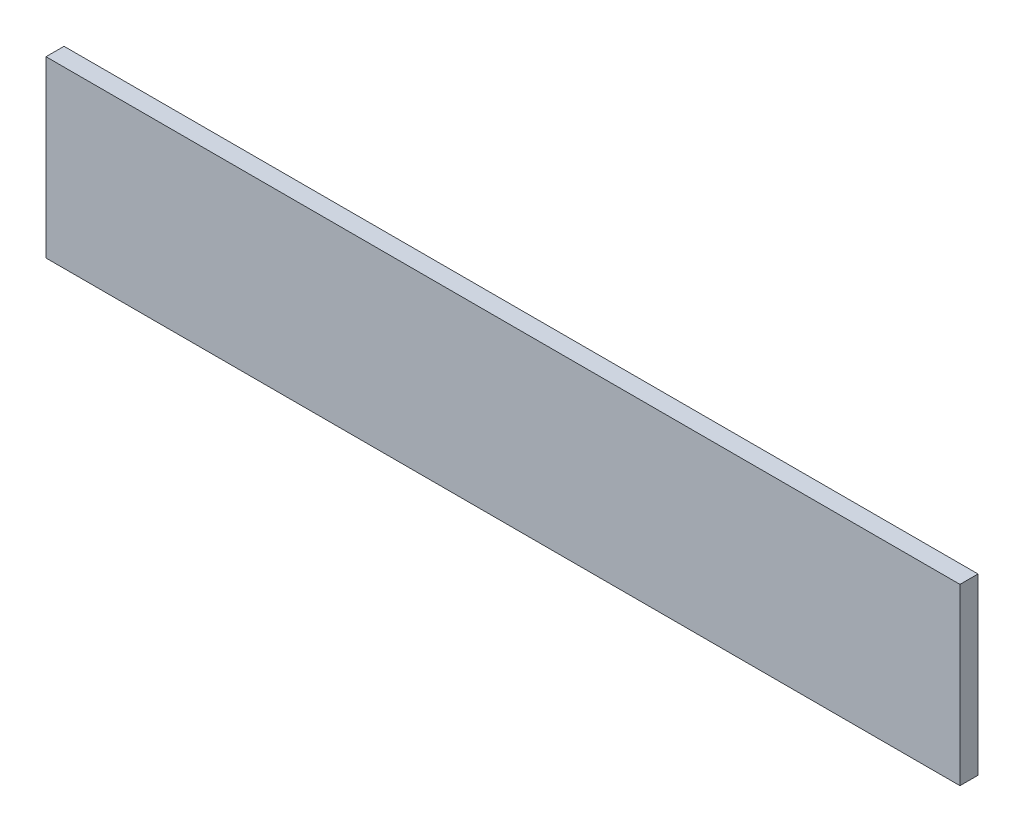
ISO-10303-21;
HEADER;
FILE_DESCRIPTION(('STEP AP214'),'2;1');
FILE_NAME('part.step','',(''),(''),'','','');
FILE_SCHEMA(('AUTOMOTIVE_DESIGN { 1 0 10303 214 1 1 1 1 }'));
ENDSEC;
DATA;
#1=APPLICATION_CONTEXT('core data for automotive mechanical design processes');
#2=APPLICATION_PROTOCOL_DEFINITION('international standard','automotive_design',2000,#1);
#3=PRODUCT_CONTEXT('',#1,'mechanical');
#4=PRODUCT('Part','Part','',(#3));
#5=PRODUCT_RELATED_PRODUCT_CATEGORY('part','',(#4));
#6=PRODUCT_DEFINITION_FORMATION('','',#4);
#7=PRODUCT_DEFINITION_CONTEXT('part definition',#1,'design');
#8=PRODUCT_DEFINITION('design','',#6,#7);
#9=PRODUCT_DEFINITION_SHAPE('','',#8);
#10=(LENGTH_UNIT() NAMED_UNIT(*) SI_UNIT(.MILLI.,.METRE.));
#11=(NAMED_UNIT(*) PLANE_ANGLE_UNIT() SI_UNIT($,.RADIAN.));
#12=(NAMED_UNIT(*) SI_UNIT($,.STERADIAN.) SOLID_ANGLE_UNIT());
#13=UNCERTAINTY_MEASURE_WITH_UNIT(LENGTH_MEASURE(1.E-05),#10,'distance_accuracy_value','');
#14=(GEOMETRIC_REPRESENTATION_CONTEXT(3) GLOBAL_UNCERTAINTY_ASSIGNED_CONTEXT((#13)) GLOBAL_UNIT_ASSIGNED_CONTEXT((#10,
#11,#12)) REPRESENTATION_CONTEXT('',''));
#15=CARTESIAN_POINT('',(0.,0.,0.));
#16=DIRECTION('',(0.,0.,1.));
#17=DIRECTION('',(1.,0.,0.));
#18=AXIS2_PLACEMENT_3D('',#15,#16,#17);
#19=CARTESIAN_POINT('',(0.,0.,19.05));
#20=DIRECTION('',(1.,0.,0.));
#21=DIRECTION('',(0.,0.,-1.));
#22=AXIS2_PLACEMENT_3D('',#19,#20,#21);
#23=PLANE('',#22);
#24=DIRECTION('',(0.,-1.,0.));
#25=VECTOR('',#24,1.);
#26=CARTESIAN_POINT('',(0.,0.,0.));
#27=LINE('',#26,#25);
#28=CARTESIAN_POINT('',(0.,184.15,0.));
#29=VERTEX_POINT('',#28);
#30=CARTESIAN_POINT('',(0.,0.,0.));
#31=VERTEX_POINT('',#30);
#32=EDGE_CURVE('E96',#29,#31,#27,.T.);
#33=ORIENTED_EDGE('',*,*,#32,.T.);
#34=DIRECTION('',(0.,0.,-1.));
#35=VECTOR('',#34,1.);
#36=CARTESIAN_POINT('',(0.,0.,19.05));
#37=LINE('',#36,#35);
#38=CARTESIAN_POINT('',(0.,0.,19.05));
#39=VERTEX_POINT('',#38);
#40=EDGE_CURVE('E11',#39,#31,#37,.T.);
#41=ORIENTED_EDGE('',*,*,#40,.F.);
#42=DIRECTION('',(0.,-1.,0.));
#43=VECTOR('',#42,1.);
#44=CARTESIAN_POINT('',(0.,0.,19.05));
#45=LINE('',#44,#43);
#46=CARTESIAN_POINT('',(0.,184.15,19.05));
#47=VERTEX_POINT('',#46);
#48=EDGE_CURVE('E84',#47,#39,#45,.T.);
#49=ORIENTED_EDGE('',*,*,#48,.F.);
#50=DIRECTION('',(0.,0.,-1.));
#51=VECTOR('',#50,1.);
#52=CARTESIAN_POINT('',(0.,184.15,19.05));
#53=LINE('',#52,#51);
#54=EDGE_CURVE('E92',#47,#29,#53,.T.);
#55=ORIENTED_EDGE('',*,*,#54,.T.);
#56=EDGE_LOOP('',(#33,#41,#49,#55));
#57=FACE_BOUND('',#56,.T.);
#58=ADVANCED_FACE('F33',(#57),#23,.F.);
#59=CARTESIAN_POINT('',(0.,0.,19.05));
#60=DIRECTION('',(0.,1.,0.));
#61=DIRECTION('',(0.,0.,1.));
#62=AXIS2_PLACEMENT_3D('',#59,#60,#61);
#63=PLANE('',#62);
#64=DIRECTION('',(1.,0.,0.));
#65=VECTOR('',#64,1.);
#66=CARTESIAN_POINT('',(0.,0.,0.));
#67=LINE('',#66,#65);
#68=CARTESIAN_POINT('',(965.2,0.,0.));
#69=VERTEX_POINT('',#68);
#70=EDGE_CURVE('E88',#31,#69,#67,.T.);
#71=ORIENTED_EDGE('',*,*,#70,.T.);
#72=DIRECTION('',(0.,0.,-1.));
#73=VECTOR('',#72,1.);
#74=CARTESIAN_POINT('',(965.2,0.,19.05));
#75=LINE('',#74,#73);
#76=CARTESIAN_POINT('',(965.2,0.,19.05));
#77=VERTEX_POINT('',#76);
#78=EDGE_CURVE('E41',#77,#69,#75,.T.);
#79=ORIENTED_EDGE('',*,*,#78,.F.);
#80=DIRECTION('',(1.,0.,0.));
#81=VECTOR('',#80,1.);
#82=CARTESIAN_POINT('',(0.,0.,19.05));
#83=LINE('',#82,#81);
#84=EDGE_CURVE('E79',#39,#77,#83,.T.);
#85=ORIENTED_EDGE('',*,*,#84,.F.);
#86=ORIENTED_EDGE('',*,*,#40,.T.);
#87=EDGE_LOOP('',(#71,#79,#85,#86));
#88=FACE_BOUND('',#87,.T.);
#89=ADVANCED_FACE('F87',(#88),#63,.F.);
#90=CARTESIAN_POINT('',(965.2,0.,19.05));
#91=DIRECTION('',(-1.,0.,0.));
#92=DIRECTION('',(0.,0.,1.));
#93=AXIS2_PLACEMENT_3D('',#90,#91,#92);
#94=PLANE('',#93);
#95=DIRECTION('',(0.,1.,0.));
#96=VECTOR('',#95,1.);
#97=CARTESIAN_POINT('',(965.2,0.,0.));
#98=LINE('',#97,#96);
#99=CARTESIAN_POINT('',(965.2,184.15,0.));
#100=VERTEX_POINT('',#99);
#101=EDGE_CURVE('E66',#69,#100,#98,.T.);
#102=ORIENTED_EDGE('',*,*,#101,.T.);
#103=DIRECTION('',(0.,0.,-1.));
#104=VECTOR('',#103,1.);
#105=CARTESIAN_POINT('',(965.2,184.15,19.05));
#106=LINE('',#105,#104);
#107=CARTESIAN_POINT('',(965.2,184.15,19.05));
#108=VERTEX_POINT('',#107);
#109=EDGE_CURVE('E89',#108,#100,#106,.T.);
#110=ORIENTED_EDGE('',*,*,#109,.F.);
#111=DIRECTION('',(0.,1.,0.));
#112=VECTOR('',#111,1.);
#113=CARTESIAN_POINT('',(965.2,0.,19.05));
#114=LINE('',#113,#112);
#115=EDGE_CURVE('E82',#77,#108,#114,.T.);
#116=ORIENTED_EDGE('',*,*,#115,.F.);
#117=ORIENTED_EDGE('',*,*,#78,.T.);
#118=EDGE_LOOP('',(#102,#110,#116,#117));
#119=FACE_BOUND('',#118,.T.);
#120=ADVANCED_FACE('F90',(#119),#94,.F.);
#121=CARTESIAN_POINT('',(0.,184.15,19.05));
#122=DIRECTION('',(0.,-1.,0.));
#123=DIRECTION('',(0.,0.,-1.));
#124=AXIS2_PLACEMENT_3D('',#121,#122,#123);
#125=PLANE('',#124);
#126=DIRECTION('',(-1.,0.,0.));
#127=VECTOR('',#126,1.);
#128=CARTESIAN_POINT('',(0.,184.15,0.));
#129=LINE('',#128,#127);
#130=EDGE_CURVE('E72',#100,#29,#129,.T.);
#131=ORIENTED_EDGE('',*,*,#130,.T.);
#132=ORIENTED_EDGE('',*,*,#54,.F.);
#133=DIRECTION('',(-1.,0.,0.));
#134=VECTOR('',#133,1.);
#135=CARTESIAN_POINT('',(0.,184.15,19.05));
#136=LINE('',#135,#134);
#137=EDGE_CURVE('E49',#108,#47,#136,.T.);
#138=ORIENTED_EDGE('',*,*,#137,.F.);
#139=ORIENTED_EDGE('',*,*,#109,.T.);
#140=EDGE_LOOP('',(#131,#132,#138,#139));
#141=FACE_BOUND('',#140,.T.);
#142=ADVANCED_FACE('F103',(#141),#125,.F.);
#143=CARTESIAN_POINT('',(0.,0.,19.05));
#144=DIRECTION('',(0.,0.,-1.));
#145=DIRECTION('',(-1.,0.,0.));
#146=AXIS2_PLACEMENT_3D('',#143,#144,#145);
#147=PLANE('',#146);
#148=ORIENTED_EDGE('',*,*,#48,.T.);
#149=ORIENTED_EDGE('',*,*,#84,.T.);
#150=ORIENTED_EDGE('',*,*,#115,.T.);
#151=ORIENTED_EDGE('',*,*,#137,.T.);
#152=EDGE_LOOP('',(#148,#149,#150,#151));
#153=FACE_BOUND('',#152,.T.);
#154=ADVANCED_FACE('F80',(#153),#147,.F.);
#155=CARTESIAN_POINT('',(0.,0.,0.));
#156=DIRECTION('',(0.,0.,-1.));
#157=DIRECTION('',(-1.,0.,0.));
#158=AXIS2_PLACEMENT_3D('',#155,#156,#157);
#159=PLANE('',#158);
#160=ORIENTED_EDGE('',*,*,#32,.F.);
#161=ORIENTED_EDGE('',*,*,#130,.F.);
#162=ORIENTED_EDGE('',*,*,#101,.F.);
#163=ORIENTED_EDGE('',*,*,#70,.F.);
#164=EDGE_LOOP('',(#160,#161,#162,#163));
#165=FACE_BOUND('',#164,.T.);
#166=ADVANCED_FACE('F106',(#165),#159,.T.);
#167=CLOSED_SHELL('',(#58,#89,#120,#142,#154,#166));
#168=MANIFOLD_SOLID_BREP('B2',#167);
#169=ADVANCED_BREP_SHAPE_REPRESENTATION('',(#18,#168),#14);
#170=SHAPE_DEFINITION_REPRESENTATION(#9,#169);
ENDSEC;
END-ISO-10303-21;
